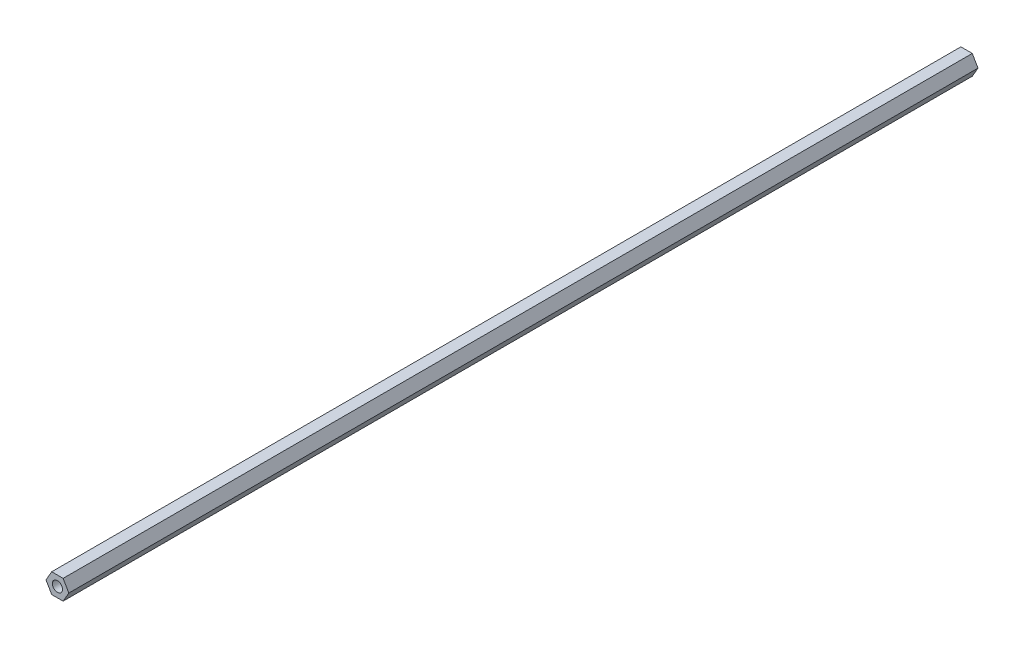
ISO-10303-21;
HEADER;
FILE_DESCRIPTION(('STEP AP214'),'2;1');
FILE_NAME('part.step','',(''),(''),'','','');
FILE_SCHEMA(('AUTOMOTIVE_DESIGN { 1 0 10303 214 1 1 1 1 }'));
ENDSEC;
DATA;
#1=APPLICATION_CONTEXT('core data for automotive mechanical design processes');
#2=APPLICATION_PROTOCOL_DEFINITION('international standard','automotive_design',2000,#1);
#3=PRODUCT_CONTEXT('',#1,'mechanical');
#4=PRODUCT('Part','Part','',(#3));
#5=PRODUCT_RELATED_PRODUCT_CATEGORY('part','',(#4));
#6=PRODUCT_DEFINITION_FORMATION('','',#4);
#7=PRODUCT_DEFINITION_CONTEXT('part definition',#1,'design');
#8=PRODUCT_DEFINITION('design','',#6,#7);
#9=PRODUCT_DEFINITION_SHAPE('','',#8);
#10=(LENGTH_UNIT() NAMED_UNIT(*) SI_UNIT(.MILLI.,.METRE.));
#11=(NAMED_UNIT(*) PLANE_ANGLE_UNIT() SI_UNIT($,.RADIAN.));
#12=(NAMED_UNIT(*) SI_UNIT($,.STERADIAN.) SOLID_ANGLE_UNIT());
#13=UNCERTAINTY_MEASURE_WITH_UNIT(LENGTH_MEASURE(1.E-05),#10,'distance_accuracy_value','');
#14=(GEOMETRIC_REPRESENTATION_CONTEXT(3) GLOBAL_UNCERTAINTY_ASSIGNED_CONTEXT((#13)) GLOBAL_UNIT_ASSIGNED_CONTEXT((#10,
#11,#12)) REPRESENTATION_CONTEXT('',''));
#15=CARTESIAN_POINT('',(0.,0.,0.));
#16=DIRECTION('',(0.,0.,1.));
#17=DIRECTION('',(1.,0.,0.));
#18=AXIS2_PLACEMENT_3D('',#15,#16,#17);
#19=CARTESIAN_POINT('',(0.,0.,584.2));
#20=DIRECTION('',(0.,0.,1.));
#21=DIRECTION('',(1.,0.,0.));
#22=AXIS2_PLACEMENT_3D('',#19,#20,#21);
#23=PLANE('',#22);
#24=DIRECTION('',(-1.,0.,0.));
#25=VECTOR('',#24,1.);
#26=CARTESIAN_POINT('',(3.66617420935412,6.35,584.2));
#27=LINE('',#26,#25);
#28=CARTESIAN_POINT('',(3.66617420935412,6.35,584.2));
#29=VERTEX_POINT('',#28);
#30=CARTESIAN_POINT('',(-3.66617420935412,6.35,584.2));
#31=VERTEX_POINT('',#30);
#32=EDGE_CURVE('E131',#29,#31,#27,.T.);
#33=ORIENTED_EDGE('',*,*,#32,.T.);
#34=DIRECTION('',(-0.5,-0.866025403784439,0.));
#35=VECTOR('',#34,1.);
#36=CARTESIAN_POINT('',(-3.66617420935412,6.35,584.2));
#37=LINE('',#36,#35);
#38=CARTESIAN_POINT('',(-7.33234841870825,0.,584.2));
#39=VERTEX_POINT('',#38);
#40=EDGE_CURVE('E89',#31,#39,#37,.T.);
#41=ORIENTED_EDGE('',*,*,#40,.T.);
#42=DIRECTION('',(0.5,-0.866025403784438,0.));
#43=VECTOR('',#42,1.);
#44=CARTESIAN_POINT('',(-7.33234841870825,0.,584.2));
#45=LINE('',#44,#43);
#46=CARTESIAN_POINT('',(-3.66617420935412,-6.35,584.2));
#47=VERTEX_POINT('',#46);
#48=EDGE_CURVE('E102',#39,#47,#45,.T.);
#49=ORIENTED_EDGE('',*,*,#48,.T.);
#50=DIRECTION('',(1.,0.,0.));
#51=VECTOR('',#50,1.);
#52=CARTESIAN_POINT('',(-3.66617420935412,-6.35,584.2));
#53=LINE('',#52,#51);
#54=CARTESIAN_POINT('',(3.66617420935412,-6.35,584.2));
#55=VERTEX_POINT('',#54);
#56=EDGE_CURVE('E96',#47,#55,#53,.T.);
#57=ORIENTED_EDGE('',*,*,#56,.T.);
#58=DIRECTION('',(0.5,0.866025403784439,0.));
#59=VECTOR('',#58,1.);
#60=CARTESIAN_POINT('',(3.66617420935412,-6.35,584.2));
#61=LINE('',#60,#59);
#62=CARTESIAN_POINT('',(7.33234841870824,0.,584.2));
#63=VERTEX_POINT('',#62);
#64=EDGE_CURVE('E100',#55,#63,#61,.T.);
#65=ORIENTED_EDGE('',*,*,#64,.T.);
#66=DIRECTION('',(-0.5,0.866025403784439,0.));
#67=VECTOR('',#66,1.);
#68=CARTESIAN_POINT('',(7.33234841870824,0.,584.2));
#69=LINE('',#68,#67);
#70=EDGE_CURVE('E52',#63,#29,#69,.T.);
#71=ORIENTED_EDGE('',*,*,#70,.T.);
#72=EDGE_LOOP('',(#33,#41,#49,#57,#65,#71));
#73=FACE_BOUND('',#72,.T.);
#74=CARTESIAN_POINT('',(0.,0.,584.2));
#75=DIRECTION('',(0.,0.,1.));
#76=DIRECTION('',(1.,0.,0.));
#77=AXIS2_PLACEMENT_3D('',#74,#75,#76);
#78=CIRCLE('',#77,3.2639);
#79=CARTESIAN_POINT('',(3.2639,0.,584.2));
#80=VERTEX_POINT('',#79);
#81=EDGE_CURVE('E124',#80,#80,#78,.T.);
#82=ORIENTED_EDGE('',*,*,#81,.F.);
#83=EDGE_LOOP('',(#82));
#84=FACE_BOUND('',#83,.T.);
#85=ADVANCED_FACE('F35',(#73,#84),#23,.T.);
#86=CARTESIAN_POINT('',(0.,0.,0.));
#87=DIRECTION('',(0.,0.,1.));
#88=DIRECTION('',(1.,0.,0.));
#89=AXIS2_PLACEMENT_3D('',#86,#87,#88);
#90=PLANE('',#89);
#91=DIRECTION('',(-1.,0.,0.));
#92=VECTOR('',#91,1.);
#93=CARTESIAN_POINT('',(3.66617420935412,6.35,0.));
#94=LINE('',#93,#92);
#95=CARTESIAN_POINT('',(3.66617420935412,6.35,0.));
#96=VERTEX_POINT('',#95);
#97=CARTESIAN_POINT('',(-3.66617420935412,6.35,0.));
#98=VERTEX_POINT('',#97);
#99=EDGE_CURVE('E120',#96,#98,#94,.T.);
#100=ORIENTED_EDGE('',*,*,#99,.F.);
#101=DIRECTION('',(-0.5,0.866025403784439,0.));
#102=VECTOR('',#101,1.);
#103=CARTESIAN_POINT('',(7.33234841870824,0.,0.));
#104=LINE('',#103,#102);
#105=CARTESIAN_POINT('',(7.33234841870824,0.,0.));
#106=VERTEX_POINT('',#105);
#107=EDGE_CURVE('E81',#106,#96,#104,.T.);
#108=ORIENTED_EDGE('',*,*,#107,.F.);
#109=DIRECTION('',(0.5,0.866025403784439,0.));
#110=VECTOR('',#109,1.);
#111=CARTESIAN_POINT('',(3.66617420935412,-6.35,0.));
#112=LINE('',#111,#110);
#113=CARTESIAN_POINT('',(3.66617420935412,-6.35,0.));
#114=VERTEX_POINT('',#113);
#115=EDGE_CURVE('E75',#114,#106,#112,.T.);
#116=ORIENTED_EDGE('',*,*,#115,.F.);
#117=DIRECTION('',(1.,0.,0.));
#118=VECTOR('',#117,1.);
#119=CARTESIAN_POINT('',(-3.66617420935412,-6.35,0.));
#120=LINE('',#119,#118);
#121=CARTESIAN_POINT('',(-3.66617420935412,-6.35,0.));
#122=VERTEX_POINT('',#121);
#123=EDGE_CURVE('E110',#122,#114,#120,.T.);
#124=ORIENTED_EDGE('',*,*,#123,.F.);
#125=DIRECTION('',(0.5,-0.866025403784438,0.));
#126=VECTOR('',#125,1.);
#127=CARTESIAN_POINT('',(-7.33234841870825,0.,0.));
#128=LINE('',#127,#126);
#129=CARTESIAN_POINT('',(-7.33234841870825,0.,0.));
#130=VERTEX_POINT('',#129);
#131=EDGE_CURVE('E126',#130,#122,#128,.T.);
#132=ORIENTED_EDGE('',*,*,#131,.F.);
#133=DIRECTION('',(-0.5,-0.866025403784439,0.));
#134=VECTOR('',#133,1.);
#135=CARTESIAN_POINT('',(-3.66617420935412,6.35,0.));
#136=LINE('',#135,#134);
#137=EDGE_CURVE('E123',#98,#130,#136,.T.);
#138=ORIENTED_EDGE('',*,*,#137,.F.);
#139=EDGE_LOOP('',(#100,#108,#116,#124,#132,#138));
#140=FACE_BOUND('',#139,.T.);
#141=CARTESIAN_POINT('',(0.,0.,0.));
#142=DIRECTION('',(0.,0.,1.));
#143=DIRECTION('',(1.,0.,0.));
#144=AXIS2_PLACEMENT_3D('',#141,#142,#143);
#145=CIRCLE('',#144,3.2639);
#146=CARTESIAN_POINT('',(3.2639,0.,0.));
#147=VERTEX_POINT('',#146);
#148=EDGE_CURVE('E224',#147,#147,#145,.T.);
#149=ORIENTED_EDGE('',*,*,#148,.T.);
#150=EDGE_LOOP('',(#149));
#151=FACE_BOUND('',#150,.T.);
#152=ADVANCED_FACE('F140',(#140,#151),#90,.F.);
#153=CARTESIAN_POINT('',(3.66617420935412,6.35,584.2));
#154=DIRECTION('',(0.,-1.,0.));
#155=DIRECTION('',(1.,0.,0.));
#156=AXIS2_PLACEMENT_3D('',#153,#154,#155);
#157=PLANE('',#156);
#158=ORIENTED_EDGE('',*,*,#99,.T.);
#159=DIRECTION('',(0.,0.,-1.));
#160=VECTOR('',#159,1.);
#161=CARTESIAN_POINT('',(-3.66617420935412,6.35,584.2));
#162=LINE('',#161,#160);
#163=EDGE_CURVE('E11',#31,#98,#162,.T.);
#164=ORIENTED_EDGE('',*,*,#163,.F.);
#165=ORIENTED_EDGE('',*,*,#32,.F.);
#166=DIRECTION('',(0.,0.,-1.));
#167=VECTOR('',#166,1.);
#168=CARTESIAN_POINT('',(3.66617420935412,6.35,584.2));
#169=LINE('',#168,#167);
#170=EDGE_CURVE('E116',#29,#96,#169,.T.);
#171=ORIENTED_EDGE('',*,*,#170,.T.);
#172=EDGE_LOOP('',(#158,#164,#165,#171));
#173=FACE_BOUND('',#172,.T.);
#174=ADVANCED_FACE('F37',(#173),#157,.F.);
#175=CARTESIAN_POINT('',(-3.66617420935412,6.35,584.2));
#176=DIRECTION('',(0.866025403784439,-0.5,0.));
#177=DIRECTION('',(0.5,0.866025403784439,0.));
#178=AXIS2_PLACEMENT_3D('',#175,#176,#177);
#179=PLANE('',#178);
#180=ORIENTED_EDGE('',*,*,#137,.T.);
#181=DIRECTION('',(0.,0.,-1.));
#182=VECTOR('',#181,1.);
#183=CARTESIAN_POINT('',(-7.33234841870825,0.,584.2));
#184=LINE('',#183,#182);
#185=EDGE_CURVE('E44',#39,#130,#184,.T.);
#186=ORIENTED_EDGE('',*,*,#185,.F.);
#187=ORIENTED_EDGE('',*,*,#40,.F.);
#188=ORIENTED_EDGE('',*,*,#163,.T.);
#189=EDGE_LOOP('',(#180,#186,#187,#188));
#190=FACE_BOUND('',#189,.T.);
#191=ADVANCED_FACE('F165',(#190),#179,.F.);
#192=CARTESIAN_POINT('',(-7.33234841870825,0.,584.2));
#193=DIRECTION('',(0.866025403784438,0.5,0.));
#194=DIRECTION('',(-0.5,0.866025403784439,0.));
#195=AXIS2_PLACEMENT_3D('',#192,#193,#194);
#196=PLANE('',#195);
#197=ORIENTED_EDGE('',*,*,#131,.T.);
#198=DIRECTION('',(0.,0.,-1.));
#199=VECTOR('',#198,1.);
#200=CARTESIAN_POINT('',(-3.66617420935412,-6.35,584.2));
#201=LINE('',#200,#199);
#202=EDGE_CURVE('E111',#47,#122,#201,.T.);
#203=ORIENTED_EDGE('',*,*,#202,.F.);
#204=ORIENTED_EDGE('',*,*,#48,.F.);
#205=ORIENTED_EDGE('',*,*,#185,.T.);
#206=EDGE_LOOP('',(#197,#203,#204,#205));
#207=FACE_BOUND('',#206,.T.);
#208=ADVANCED_FACE('F137',(#207),#196,.F.);
#209=CARTESIAN_POINT('',(-3.66617420935412,-6.35,584.2));
#210=DIRECTION('',(0.,1.,0.));
#211=DIRECTION('',(-1.,0.,0.));
#212=AXIS2_PLACEMENT_3D('',#209,#210,#211);
#213=PLANE('',#212);
#214=ORIENTED_EDGE('',*,*,#123,.T.);
#215=DIRECTION('',(0.,0.,-1.));
#216=VECTOR('',#215,1.);
#217=CARTESIAN_POINT('',(3.66617420935412,-6.35,584.2));
#218=LINE('',#217,#216);
#219=EDGE_CURVE('E107',#55,#114,#218,.T.);
#220=ORIENTED_EDGE('',*,*,#219,.F.);
#221=ORIENTED_EDGE('',*,*,#56,.F.);
#222=ORIENTED_EDGE('',*,*,#202,.T.);
#223=EDGE_LOOP('',(#214,#220,#221,#222));
#224=FACE_BOUND('',#223,.T.);
#225=ADVANCED_FACE('F108',(#224),#213,.F.);
#226=CARTESIAN_POINT('',(3.66617420935412,-6.35,584.2));
#227=DIRECTION('',(-0.866025403784439,0.5,0.));
#228=DIRECTION('',(-0.5,-0.866025403784439,0.));
#229=AXIS2_PLACEMENT_3D('',#226,#227,#228);
#230=PLANE('',#229);
#231=ORIENTED_EDGE('',*,*,#115,.T.);
#232=DIRECTION('',(0.,0.,-1.));
#233=VECTOR('',#232,1.);
#234=CARTESIAN_POINT('',(7.33234841870824,0.,584.2));
#235=LINE('',#234,#233);
#236=EDGE_CURVE('E112',#63,#106,#235,.T.);
#237=ORIENTED_EDGE('',*,*,#236,.F.);
#238=ORIENTED_EDGE('',*,*,#64,.F.);
#239=ORIENTED_EDGE('',*,*,#219,.T.);
#240=EDGE_LOOP('',(#231,#237,#238,#239));
#241=FACE_BOUND('',#240,.T.);
#242=ADVANCED_FACE('F114',(#241),#230,.F.);
#243=CARTESIAN_POINT('',(7.33234841870824,0.,584.2));
#244=DIRECTION('',(-0.866025403784439,-0.5,0.));
#245=DIRECTION('',(0.5,-0.866025403784439,0.));
#246=AXIS2_PLACEMENT_3D('',#243,#244,#245);
#247=PLANE('',#246);
#248=ORIENTED_EDGE('',*,*,#107,.T.);
#249=ORIENTED_EDGE('',*,*,#170,.F.);
#250=ORIENTED_EDGE('',*,*,#70,.F.);
#251=ORIENTED_EDGE('',*,*,#236,.T.);
#252=EDGE_LOOP('',(#248,#249,#250,#251));
#253=FACE_BOUND('',#252,.T.);
#254=ADVANCED_FACE('F145',(#253),#247,.F.);
#255=CARTESIAN_POINT('',(0.,0.,584.2));
#256=DIRECTION('',(0.,0.,-1.));
#257=DIRECTION('',(-1.,0.,0.));
#258=AXIS2_PLACEMENT_3D('',#255,#256,#257);
#259=CYLINDRICAL_SURFACE('',#258,3.2639);
#260=ORIENTED_EDGE('',*,*,#81,.T.);
#261=EDGE_LOOP('',(#260));
#262=FACE_BOUND('',#261,.T.);
#263=ORIENTED_EDGE('',*,*,#148,.F.);
#264=EDGE_LOOP('',(#263));
#265=FACE_BOUND('',#264,.T.);
#266=ADVANCED_FACE('F147',(#262,#265),#259,.F.);
#267=CLOSED_SHELL('',(#85,#152,#174,#191,#208,#225,#242,#254,#266));
#268=MANIFOLD_SOLID_BREP('B2',#267);
#269=ADVANCED_BREP_SHAPE_REPRESENTATION('',(#18,#268),#14);
#270=SHAPE_DEFINITION_REPRESENTATION(#9,#269);
ENDSEC;
END-ISO-10303-21;
